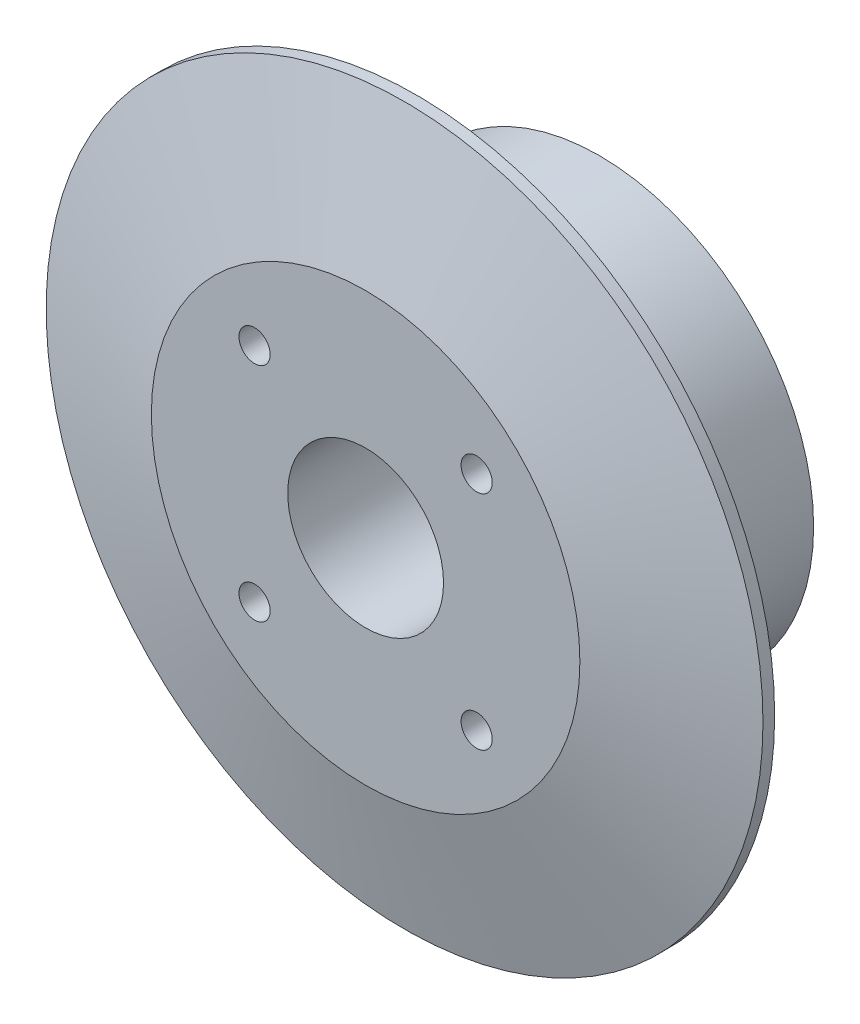
ISO-10303-21;
HEADER;
FILE_DESCRIPTION(('STEP AP214'),'2;1');
FILE_NAME('part.step','',(''),(''),'','','');
FILE_SCHEMA(('AUTOMOTIVE_DESIGN { 1 0 10303 214 1 1 1 1 }'));
ENDSEC;
DATA;
#1=APPLICATION_CONTEXT('core data for automotive mechanical design processes');
#2=APPLICATION_PROTOCOL_DEFINITION('international standard','automotive_design',2000,#1);
#3=PRODUCT_CONTEXT('',#1,'mechanical');
#4=PRODUCT('Part','Part','',(#3));
#5=PRODUCT_RELATED_PRODUCT_CATEGORY('part','',(#4));
#6=PRODUCT_DEFINITION_FORMATION('','',#4);
#7=PRODUCT_DEFINITION_CONTEXT('part definition',#1,'design');
#8=PRODUCT_DEFINITION('design','',#6,#7);
#9=PRODUCT_DEFINITION_SHAPE('','',#8);
#10=(LENGTH_UNIT() NAMED_UNIT(*) SI_UNIT(.MILLI.,.METRE.));
#11=(NAMED_UNIT(*) PLANE_ANGLE_UNIT() SI_UNIT($,.RADIAN.));
#12=(NAMED_UNIT(*) SI_UNIT($,.STERADIAN.) SOLID_ANGLE_UNIT());
#13=UNCERTAINTY_MEASURE_WITH_UNIT(LENGTH_MEASURE(1.E-05),#10,'distance_accuracy_value','');
#14=(GEOMETRIC_REPRESENTATION_CONTEXT(3) GLOBAL_UNCERTAINTY_ASSIGNED_CONTEXT((#13)) GLOBAL_UNIT_ASSIGNED_CONTEXT((#10,
#11,#12)) REPRESENTATION_CONTEXT('',''));
#15=CARTESIAN_POINT('',(0.,0.,0.));
#16=DIRECTION('',(0.,0.,1.));
#17=DIRECTION('',(1.,0.,0.));
#18=AXIS2_PLACEMENT_3D('',#15,#16,#17);
#19=CARTESIAN_POINT('',(0.,0.,467.574650711476));
#20=DIRECTION('',(0.,0.,1.));
#21=DIRECTION('',(1.,0.,0.));
#22=AXIS2_PLACEMENT_3D('',#19,#20,#21);
#23=CYLINDRICAL_SURFACE('',#22,10.);
#24=CARTESIAN_POINT('',(0.,0.,-30.));
#25=DIRECTION('',(0.,0.,1.));
#26=DIRECTION('',(1.,0.,0.));
#27=AXIS2_PLACEMENT_3D('',#24,#25,#26);
#28=CIRCLE('',#27,10.);
#29=CARTESIAN_POINT('',(10.,0.,-30.));
#30=VERTEX_POINT('',#29);
#31=EDGE_CURVE('E56',#30,#30,#28,.T.);
#32=ORIENTED_EDGE('',*,*,#31,.F.);
#33=EDGE_LOOP('',(#32));
#34=FACE_BOUND('',#33,.T.);
#35=CARTESIAN_POINT('',(0.,0.,0.));
#36=DIRECTION('',(0.,0.,1.));
#37=DIRECTION('',(1.,0.,0.));
#38=AXIS2_PLACEMENT_3D('',#35,#36,#37);
#39=CIRCLE('',#38,10.);
#40=CARTESIAN_POINT('',(10.,0.,0.));
#41=VERTEX_POINT('',#40);
#42=EDGE_CURVE('E10',#41,#41,#39,.T.);
#43=ORIENTED_EDGE('',*,*,#42,.T.);
#44=EDGE_LOOP('',(#43));
#45=FACE_BOUND('',#44,.T.);
#46=ADVANCED_FACE('F31',(#34,#45),#23,.F.);
#47=CARTESIAN_POINT('',(0.,10.,0.));
#48=DIRECTION('',(0.,0.,-1.));
#49=DIRECTION('',(-1.,0.,0.));
#50=AXIS2_PLACEMENT_3D('',#47,#48,#49);
#51=PLANE('',#50);
#52=CARTESIAN_POINT('',(-14.25,-14.25,0.));
#53=DIRECTION('',(0.,0.,1.));
#54=DIRECTION('',(1.,0.,0.));
#55=AXIS2_PLACEMENT_3D('',#52,#53,#54);
#56=CIRCLE('',#55,2.);
#57=CARTESIAN_POINT('',(-12.25,-14.25,0.));
#58=VERTEX_POINT('',#57);
#59=EDGE_CURVE('E66',#58,#58,#56,.T.);
#60=ORIENTED_EDGE('',*,*,#59,.F.);
#61=EDGE_LOOP('',(#60));
#62=FACE_BOUND('',#61,.T.);
#63=CARTESIAN_POINT('',(14.25,-14.25,0.));
#64=DIRECTION('',(0.,0.,1.));
#65=DIRECTION('',(1.,0.,0.));
#66=AXIS2_PLACEMENT_3D('',#63,#64,#65);
#67=CIRCLE('',#66,2.);
#68=CARTESIAN_POINT('',(16.25,-14.25,0.));
#69=VERTEX_POINT('',#68);
#70=EDGE_CURVE('E72',#69,#69,#67,.T.);
#71=ORIENTED_EDGE('',*,*,#70,.F.);
#72=EDGE_LOOP('',(#71));
#73=FACE_BOUND('',#72,.T.);
#74=CARTESIAN_POINT('',(14.25,14.25,0.));
#75=DIRECTION('',(0.,0.,1.));
#76=DIRECTION('',(1.,0.,0.));
#77=AXIS2_PLACEMENT_3D('',#74,#75,#76);
#78=CIRCLE('',#77,2.);
#79=CARTESIAN_POINT('',(16.25,14.25,0.));
#80=VERTEX_POINT('',#79);
#81=EDGE_CURVE('E78',#80,#80,#78,.T.);
#82=ORIENTED_EDGE('',*,*,#81,.F.);
#83=EDGE_LOOP('',(#82));
#84=FACE_BOUND('',#83,.T.);
#85=CARTESIAN_POINT('',(-14.25,14.25,0.));
#86=DIRECTION('',(0.,0.,1.));
#87=DIRECTION('',(1.,0.,0.));
#88=AXIS2_PLACEMENT_3D('',#85,#86,#87);
#89=CIRCLE('',#88,2.);
#90=CARTESIAN_POINT('',(-12.25,14.25,0.));
#91=VERTEX_POINT('',#90);
#92=EDGE_CURVE('E60',#91,#91,#89,.T.);
#93=ORIENTED_EDGE('',*,*,#92,.F.);
#94=EDGE_LOOP('',(#93));
#95=FACE_BOUND('',#94,.T.);
#96=ORIENTED_EDGE('',*,*,#42,.F.);
#97=EDGE_LOOP('',(#96));
#98=FACE_BOUND('',#97,.T.);
#99=CARTESIAN_POINT('',(0.,0.,0.));
#100=DIRECTION('',(0.,0.,1.));
#101=DIRECTION('',(1.,0.,0.));
#102=AXIS2_PLACEMENT_3D('',#99,#100,#101);
#103=CIRCLE('',#102,27.5);
#104=CARTESIAN_POINT('',(27.5,0.,0.));
#105=VERTEX_POINT('',#104);
#106=EDGE_CURVE('E37',#105,#105,#103,.T.);
#107=ORIENTED_EDGE('',*,*,#106,.T.);
#108=EDGE_LOOP('',(#107));
#109=FACE_BOUND('',#108,.T.);
#110=ADVANCED_FACE('F95',(#62,#73,#84,#95,#98,#109),#51,.F.);
#111=CARTESIAN_POINT('',(0.,0.,-5.));
#112=DIRECTION('',(0.,0.,-1.));
#113=DIRECTION('',(-1.,0.,0.));
#114=AXIS2_PLACEMENT_3D('',#111,#112,#113);
#115=CONICAL_SURFACE('',#114,46.,1.30683260316919);
#116=ORIENTED_EDGE('',*,*,#106,.F.);
#117=EDGE_LOOP('',(#116));
#118=FACE_BOUND('',#117,.T.);
#119=CARTESIAN_POINT('',(0.,0.,-5.));
#120=DIRECTION('',(0.,0.,1.));
#121=DIRECTION('',(1.,0.,0.));
#122=AXIS2_PLACEMENT_3D('',#119,#120,#121);
#123=CIRCLE('',#122,46.);
#124=CARTESIAN_POINT('',(46.,0.,-5.));
#125=VERTEX_POINT('',#124);
#126=EDGE_CURVE('E41',#125,#125,#123,.T.);
#127=ORIENTED_EDGE('',*,*,#126,.T.);
#128=EDGE_LOOP('',(#127));
#129=FACE_BOUND('',#128,.T.);
#130=ADVANCED_FACE('F98',(#118,#129),#115,.T.);
#131=CARTESIAN_POINT('',(0.,0.,467.574650711476));
#132=DIRECTION('',(0.,0.,1.));
#133=DIRECTION('',(1.,0.,0.));
#134=AXIS2_PLACEMENT_3D('',#131,#132,#133);
#135=CYLINDRICAL_SURFACE('',#134,46.);
#136=ORIENTED_EDGE('',*,*,#126,.F.);
#137=EDGE_LOOP('',(#136));
#138=FACE_BOUND('',#137,.T.);
#139=CARTESIAN_POINT('',(0.,0.,-6.50000000000001));
#140=DIRECTION('',(0.,0.,1.));
#141=DIRECTION('',(1.,0.,0.));
#142=AXIS2_PLACEMENT_3D('',#139,#140,#141);
#143=CIRCLE('',#142,46.);
#144=CARTESIAN_POINT('',(46.,0.,-6.50000000000001));
#145=VERTEX_POINT('',#144);
#146=EDGE_CURVE('E45',#145,#145,#143,.T.);
#147=ORIENTED_EDGE('',*,*,#146,.T.);
#148=EDGE_LOOP('',(#147));
#149=FACE_BOUND('',#148,.T.);
#150=ADVANCED_FACE('F135',(#138,#149),#135,.T.);
#151=CARTESIAN_POINT('',(0.,0.,-1.5));
#152=DIRECTION('',(0.,0.,-1.));
#153=DIRECTION('',(-1.,0.,0.));
#154=AXIS2_PLACEMENT_3D('',#151,#152,#153);
#155=CONICAL_SURFACE('',#154,27.5,1.30683260316919);
#156=ORIENTED_EDGE('',*,*,#146,.F.);
#157=EDGE_LOOP('',(#156));
#158=FACE_BOUND('',#157,.T.);
#159=CARTESIAN_POINT('',(0.,0.,-1.5));
#160=DIRECTION('',(0.,0.,1.));
#161=DIRECTION('',(1.,0.,0.));
#162=AXIS2_PLACEMENT_3D('',#159,#160,#161);
#163=CIRCLE('',#162,27.5);
#164=CARTESIAN_POINT('',(27.5,0.,-1.5));
#165=VERTEX_POINT('',#164);
#166=EDGE_CURVE('E50',#165,#165,#163,.T.);
#167=ORIENTED_EDGE('',*,*,#166,.T.);
#168=EDGE_LOOP('',(#167));
#169=FACE_BOUND('',#168,.T.);
#170=ADVANCED_FACE('F142',(#158,#169),#155,.F.);
#171=CARTESIAN_POINT('',(0.,0.,467.574650711476));
#172=DIRECTION('',(0.,0.,1.));
#173=DIRECTION('',(1.,0.,0.));
#174=AXIS2_PLACEMENT_3D('',#171,#172,#173);
#175=CYLINDRICAL_SURFACE('',#174,27.5);
#176=ORIENTED_EDGE('',*,*,#166,.F.);
#177=EDGE_LOOP('',(#176));
#178=FACE_BOUND('',#177,.T.);
#179=CARTESIAN_POINT('',(0.,0.,-30.));
#180=DIRECTION('',(0.,0.,1.));
#181=DIRECTION('',(1.,0.,0.));
#182=AXIS2_PLACEMENT_3D('',#179,#180,#181);
#183=CIRCLE('',#182,27.5);
#184=CARTESIAN_POINT('',(27.5,0.,-30.));
#185=VERTEX_POINT('',#184);
#186=EDGE_CURVE('E53',#185,#185,#183,.T.);
#187=ORIENTED_EDGE('',*,*,#186,.T.);
#188=EDGE_LOOP('',(#187));
#189=FACE_BOUND('',#188,.T.);
#190=ADVANCED_FACE('F110',(#178,#189),#175,.T.);
#191=CARTESIAN_POINT('',(0.,27.5,-30.));
#192=DIRECTION('',(0.,0.,1.));
#193=DIRECTION('',(1.,0.,0.));
#194=AXIS2_PLACEMENT_3D('',#191,#192,#193);
#195=PLANE('',#194);
#196=CARTESIAN_POINT('',(-14.25,-14.25,-30.));
#197=DIRECTION('',(0.,0.,1.));
#198=DIRECTION('',(1.,0.,0.));
#199=AXIS2_PLACEMENT_3D('',#196,#197,#198);
#200=CIRCLE('',#199,2.);
#201=CARTESIAN_POINT('',(-12.25,-14.25,-30.));
#202=VERTEX_POINT('',#201);
#203=EDGE_CURVE('E69',#202,#202,#200,.T.);
#204=ORIENTED_EDGE('',*,*,#203,.T.);
#205=EDGE_LOOP('',(#204));
#206=FACE_BOUND('',#205,.T.);
#207=CARTESIAN_POINT('',(14.25,-14.25,-30.));
#208=DIRECTION('',(0.,0.,1.));
#209=DIRECTION('',(1.,0.,0.));
#210=AXIS2_PLACEMENT_3D('',#207,#208,#209);
#211=CIRCLE('',#210,2.);
#212=CARTESIAN_POINT('',(16.25,-14.25,-30.));
#213=VERTEX_POINT('',#212);
#214=EDGE_CURVE('E75',#213,#213,#211,.T.);
#215=ORIENTED_EDGE('',*,*,#214,.T.);
#216=EDGE_LOOP('',(#215));
#217=FACE_BOUND('',#216,.T.);
#218=CARTESIAN_POINT('',(14.25,14.25,-30.));
#219=DIRECTION('',(0.,0.,1.));
#220=DIRECTION('',(1.,0.,0.));
#221=AXIS2_PLACEMENT_3D('',#218,#219,#220);
#222=CIRCLE('',#221,2.);
#223=CARTESIAN_POINT('',(16.25,14.25,-30.));
#224=VERTEX_POINT('',#223);
#225=EDGE_CURVE('E63',#224,#224,#222,.T.);
#226=ORIENTED_EDGE('',*,*,#225,.T.);
#227=EDGE_LOOP('',(#226));
#228=FACE_BOUND('',#227,.T.);
#229=CARTESIAN_POINT('',(-14.25,14.25,-30.));
#230=DIRECTION('',(0.,0.,1.));
#231=DIRECTION('',(1.,0.,0.));
#232=AXIS2_PLACEMENT_3D('',#229,#230,#231);
#233=CIRCLE('',#232,2.);
#234=CARTESIAN_POINT('',(-12.25,14.25,-30.));
#235=VERTEX_POINT('',#234);
#236=EDGE_CURVE('E59',#235,#235,#233,.T.);
#237=ORIENTED_EDGE('',*,*,#236,.T.);
#238=EDGE_LOOP('',(#237));
#239=FACE_BOUND('',#238,.T.);
#240=ORIENTED_EDGE('',*,*,#186,.F.);
#241=EDGE_LOOP('',(#240));
#242=FACE_BOUND('',#241,.T.);
#243=ORIENTED_EDGE('',*,*,#31,.T.);
#244=EDGE_LOOP('',(#243));
#245=FACE_BOUND('',#244,.T.);
#246=ADVANCED_FACE('F84',(#206,#217,#228,#239,#242,#245),#195,.F.);
#247=CARTESIAN_POINT('',(-14.25,14.25,-30.));
#248=DIRECTION('',(0.,0.,1.));
#249=DIRECTION('',(1.,0.,0.));
#250=AXIS2_PLACEMENT_3D('',#247,#248,#249);
#251=CYLINDRICAL_SURFACE('',#250,2.);
#252=ORIENTED_EDGE('',*,*,#236,.F.);
#253=EDGE_LOOP('',(#252));
#254=FACE_BOUND('',#253,.T.);
#255=ORIENTED_EDGE('',*,*,#92,.T.);
#256=EDGE_LOOP('',(#255));
#257=FACE_BOUND('',#256,.T.);
#258=ADVANCED_FACE('F91',(#254,#257),#251,.F.);
#259=CARTESIAN_POINT('',(14.25,14.25,-30.));
#260=DIRECTION('',(0.,0.,1.));
#261=DIRECTION('',(1.,0.,0.));
#262=AXIS2_PLACEMENT_3D('',#259,#260,#261);
#263=CYLINDRICAL_SURFACE('',#262,2.);
#264=ORIENTED_EDGE('',*,*,#225,.F.);
#265=EDGE_LOOP('',(#264));
#266=FACE_BOUND('',#265,.T.);
#267=ORIENTED_EDGE('',*,*,#81,.T.);
#268=EDGE_LOOP('',(#267));
#269=FACE_BOUND('',#268,.T.);
#270=ADVANCED_FACE('F87',(#266,#269),#263,.F.);
#271=CARTESIAN_POINT('',(14.25,-14.25,-30.));
#272=DIRECTION('',(0.,0.,1.));
#273=DIRECTION('',(1.,0.,0.));
#274=AXIS2_PLACEMENT_3D('',#271,#272,#273);
#275=CYLINDRICAL_SURFACE('',#274,2.);
#276=ORIENTED_EDGE('',*,*,#214,.F.);
#277=EDGE_LOOP('',(#276));
#278=FACE_BOUND('',#277,.T.);
#279=ORIENTED_EDGE('',*,*,#70,.T.);
#280=EDGE_LOOP('',(#279));
#281=FACE_BOUND('',#280,.T.);
#282=ADVANCED_FACE('F90',(#278,#281),#275,.F.);
#283=CARTESIAN_POINT('',(-14.25,-14.25,-30.));
#284=DIRECTION('',(0.,0.,1.));
#285=DIRECTION('',(1.,0.,0.));
#286=AXIS2_PLACEMENT_3D('',#283,#284,#285);
#287=CYLINDRICAL_SURFACE('',#286,2.);
#288=ORIENTED_EDGE('',*,*,#203,.F.);
#289=EDGE_LOOP('',(#288));
#290=FACE_BOUND('',#289,.T.);
#291=ORIENTED_EDGE('',*,*,#59,.T.);
#292=EDGE_LOOP('',(#291));
#293=FACE_BOUND('',#292,.T.);
#294=ADVANCED_FACE('F179',(#290,#293),#287,.F.);
#295=CLOSED_SHELL('',(#46,#110,#130,#150,#170,#190,#246,#258,#270,#282,#294));
#296=MANIFOLD_SOLID_BREP('B2',#295);
#297=ADVANCED_BREP_SHAPE_REPRESENTATION('',(#18,#296),#14);
#298=SHAPE_DEFINITION_REPRESENTATION(#9,#297);
ENDSEC;
END-ISO-10303-21;
